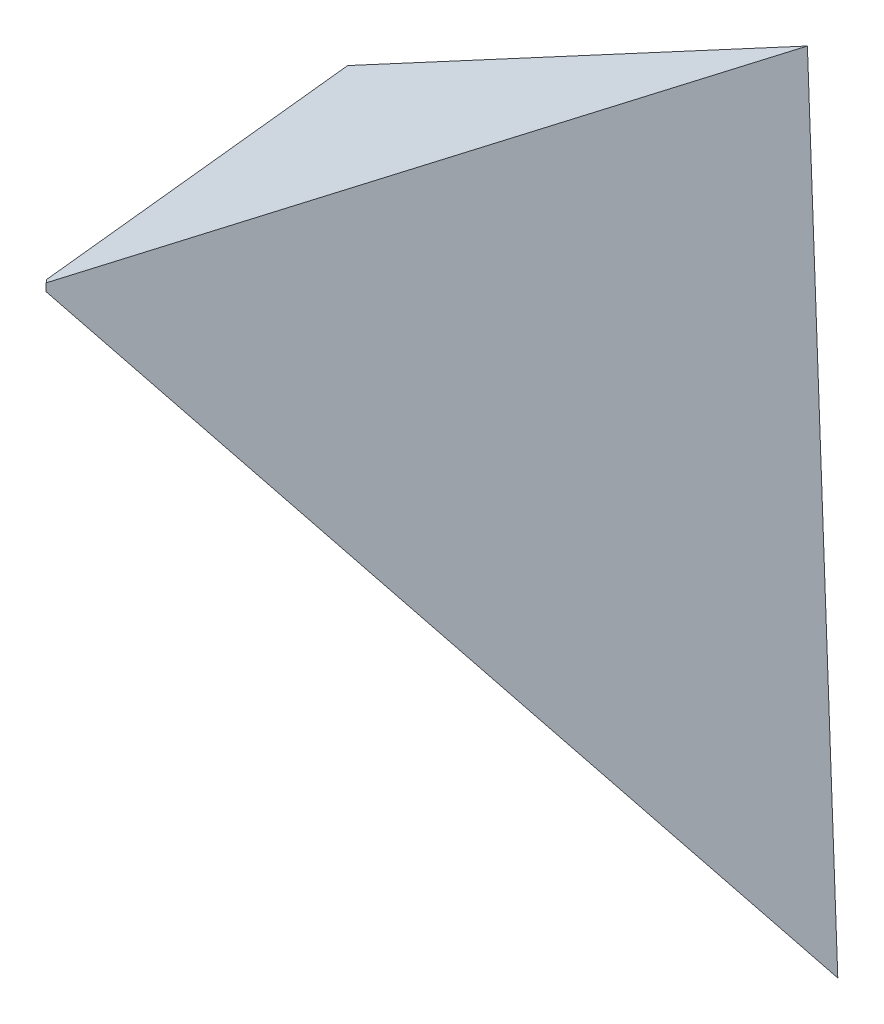
ISO-10303-21;
HEADER;
FILE_DESCRIPTION(('STEP AP214'),'2;1');
FILE_NAME('part.step','',(''),(''),'','','');
FILE_SCHEMA(('AUTOMOTIVE_DESIGN { 1 0 10303 214 1 1 1 1 }'));
ENDSEC;
DATA;
#1=APPLICATION_CONTEXT('core data for automotive mechanical design processes');
#2=APPLICATION_PROTOCOL_DEFINITION('international standard','automotive_design',2000,#1);
#3=PRODUCT_CONTEXT('',#1,'mechanical');
#4=PRODUCT('Part','Part','',(#3));
#5=PRODUCT_RELATED_PRODUCT_CATEGORY('part','',(#4));
#6=PRODUCT_DEFINITION_FORMATION('','',#4);
#7=PRODUCT_DEFINITION_CONTEXT('part definition',#1,'design');
#8=PRODUCT_DEFINITION('design','',#6,#7);
#9=PRODUCT_DEFINITION_SHAPE('','',#8);
#10=(LENGTH_UNIT() NAMED_UNIT(*) SI_UNIT(.MILLI.,.METRE.));
#11=(NAMED_UNIT(*) PLANE_ANGLE_UNIT() SI_UNIT($,.RADIAN.));
#12=(NAMED_UNIT(*) SI_UNIT($,.STERADIAN.) SOLID_ANGLE_UNIT());
#13=UNCERTAINTY_MEASURE_WITH_UNIT(LENGTH_MEASURE(1.E-05),#10,'distance_accuracy_value','');
#14=(GEOMETRIC_REPRESENTATION_CONTEXT(3) GLOBAL_UNCERTAINTY_ASSIGNED_CONTEXT((#13)) GLOBAL_UNIT_ASSIGNED_CONTEXT((#10,
#11,#12)) REPRESENTATION_CONTEXT('',''));
#15=CARTESIAN_POINT('',(0.,0.,0.));
#16=DIRECTION('',(0.,0.,1.));
#17=DIRECTION('',(1.,0.,0.));
#18=AXIS2_PLACEMENT_3D('',#15,#16,#17);
#19=CARTESIAN_POINT('',(209.23112050652,32.503640546976,175.80867233075));
#20=DIRECTION('',(-0.767091305793029,-0.000746724953363428,0.641537505512024));
#21=DIRECTION('',(-0.000973449436754686,0.999999526197985,0.));
#22=AXIS2_PLACEMENT_3D('',#19,#20,#21);
#23=PLANE('',#22);
#24=DIRECTION('',(-0.641470473020888,-0.0136095682998176,-0.767026995543866));
#25=VECTOR('',#24,1.);
#26=CARTESIAN_POINT('',(210.43033605346,35.965847138926,177.2466134144));
#27=LINE('',#26,#25);
#28=CARTESIAN_POINT('',(210.43033605346,35.965847138926,177.2466134144));
#29=VERTEX_POINT('',#28);
#30=CARTESIAN_POINT('',(207.96796166974,35.913604902121,174.30227270835));
#31=VERTEX_POINT('',#30);
#32=EDGE_CURVE('E43',#29,#31,#27,.T.);
#33=ORIENTED_EDGE('',*,*,#32,.T.);
#34=DIRECTION('',(0.00930380667661084,-0.99990710671209,0.0099607794865899));
#35=VECTOR('',#34,1.);
#36=CARTESIAN_POINT('',(207.96796166974,35.913604902121,174.30227270835));
#37=LINE('',#36,#35);
#38=CARTESIAN_POINT('',(208.03190495958,29.041433955026,174.37073124709));
#39=VERTEX_POINT('',#38);
#40=EDGE_CURVE('E106',#31,#39,#37,.T.);
#41=ORIENTED_EDGE('',*,*,#40,.T.);
#42=DIRECTION('',(0.641470473020888,0.0136095682998176,0.767026995543866));
#43=VECTOR('',#42,1.);
#44=CARTESIAN_POINT('',(208.03190495958,29.041433955026,174.37073124709));
#45=LINE('',#44,#43);
#46=CARTESIAN_POINT('',(210.4942793433,29.093676191831,177.31507195314));
#47=VERTEX_POINT('',#46);
#48=EDGE_CURVE('E100',#39,#47,#45,.T.);
#49=ORIENTED_EDGE('',*,*,#48,.T.);
#50=DIRECTION('',(-0.00930380667661584,0.99990710671209,-0.0099607794865899));
#51=VECTOR('',#50,1.);
#52=CARTESIAN_POINT('',(210.4942793433,29.093676191831,177.31507195314));
#53=LINE('',#52,#51);
#54=EDGE_CURVE('E10',#47,#29,#53,.T.);
#55=ORIENTED_EDGE('',*,*,#54,.T.);
#56=EDGE_LOOP('',(#33,#41,#49,#55));
#57=FACE_BOUND('',#56,.T.);
#58=ADVANCED_FACE('F15',(#57),#23,.T.);
#59=CARTESIAN_POINT('',(685.45305583866,35.328601961052,14.578539610758));
#60=DIRECTION('',(0.323963347202056,0.0124380243055622,0.945987867375165));
#61=DIRECTION('',(0.0383650416777523,-0.999263790786529,0.));
#62=AXIS2_PLACEMENT_3D('',#59,#60,#61);
#63=PLANE('',#62);
#64=ORIENTED_EDGE('',*,*,#54,.F.);
#65=DIRECTION('',(0.801242651909787,-0.535285983641858,-0.267355808758929));
#66=VECTOR('',#65,1.);
#67=CARTESIAN_POINT('',(210.4942793433,29.093676191831,177.31507195314));
#68=LINE('',#67,#66);
#69=CARTESIAN_POINT('',(741.89249034377,-325.9173974235,0.));
#70=VERTEX_POINT('',#69);
#71=EDGE_CURVE('E19',#47,#70,#68,.T.);
#72=ORIENTED_EDGE('',*,*,#71,.T.);
#73=DIRECTION('',(-0.0383650416777519,0.999263790786529,0.));
#74=VECTOR('',#73,1.);
#75=CARTESIAN_POINT('',(751.43129927942,-574.367182952,0.));
#76=LINE('',#75,#74);
#77=CARTESIAN_POINT('',(714.67125545038,383.09250273302,0.));
#78=VERTEX_POINT('',#77);
#79=EDGE_CURVE('E78',#70,#78,#76,.T.);
#80=ORIENTED_EDGE('',*,*,#79,.T.);
#81=DIRECTION('',(-0.791194023562528,-0.544669273675364,0.278114004309186));
#82=VECTOR('',#81,1.);
#83=CARTESIAN_POINT('',(910.249755232,517.73153721776,-68.74814282113));
#84=LINE('',#83,#82);
#85=EDGE_CURVE('E25',#78,#29,#84,.T.);
#86=ORIENTED_EDGE('',*,*,#85,.T.);
#87=EDGE_LOOP('',(#64,#72,#80,#86));
#88=FACE_BOUND('',#87,.T.);
#89=ADVANCED_FACE('F79',(#88),#63,.T.);
#90=CARTESIAN_POINT('',(534.59281678404,330.22125626934,-101.5762576263));
#91=DIRECTION('',(-0.442152801707964,0.823626691240933,0.355161897473971));
#92=DIRECTION('',(0.62624167613197,0.,0.779628990658647));
#93=AXIS2_PLACEMENT_3D('',#90,#91,#92);
#94=PLANE('',#93);
#95=ORIENTED_EDGE('',*,*,#32,.F.);
#96=ORIENTED_EDGE('',*,*,#85,.F.);
#97=DIRECTION('',(-0.881068096098351,-0.472989439668189,0.));
#98=VECTOR('',#97,1.);
#99=CARTESIAN_POINT('',(-333.2445936708,-179.4668868193,0.));
#100=LINE('',#99,#98);
#101=CARTESIAN_POINT('',(303.07806888487,162.13429127704,0.));
#102=VERTEX_POINT('',#101);
#103=EDGE_CURVE('E72',#78,#102,#100,.T.);
#104=ORIENTED_EDGE('',*,*,#103,.T.);
#105=DIRECTION('',(0.404234184859981,0.536459454869976,-0.740814401230966));
#106=VECTOR('',#105,1.);
#107=CARTESIAN_POINT('',(207.96796166974,35.913604902121,174.30227270835));
#108=LINE('',#107,#106);
#109=EDGE_CURVE('E103',#31,#102,#108,.T.);
#110=ORIENTED_EDGE('',*,*,#109,.F.);
#111=EDGE_LOOP('',(#95,#96,#104,#110));
#112=FACE_BOUND('',#111,.T.);
#113=ADVANCED_FACE('F70',(#112),#94,.T.);
#114=CARTESIAN_POINT('',(452.14653410095,30.378723241934,-264.393615672));
#115=DIRECTION('',(-0.873765212166275,-0.0129732288748441,-0.486174916404153));
#116=DIRECTION('',(-0.486215834323044,0.,0.873838750830807));
#117=AXIS2_PLACEMENT_3D('',#114,#115,#116);
#118=PLANE('',#117);
#119=ORIENTED_EDGE('',*,*,#40,.F.);
#120=ORIENTED_EDGE('',*,*,#109,.T.);
#121=DIRECTION('',(0.0148458635887471,-0.999889794094481,0.));
#122=VECTOR('',#121,1.);
#123=CARTESIAN_POINT('',(314.4208433459,-601.8175228094,0.));
#124=LINE('',#123,#122);
#125=CARTESIAN_POINT('',(306.98154270693,-100.7701610546,0.));
#126=VERTEX_POINT('',#125);
#127=EDGE_CURVE('E88',#102,#126,#124,.T.);
#128=ORIENTED_EDGE('',*,*,#127,.T.);
#129=DIRECTION('',(0.414282813217033,-0.543495802442044,-0.730056205645058));
#130=VECTOR('',#129,1.);
#131=CARTESIAN_POINT('',(208.03190495958,29.041433955026,174.37073124709));
#132=LINE('',#131,#130);
#133=EDGE_CURVE('E97',#39,#126,#132,.T.);
#134=ORIENTED_EDGE('',*,*,#133,.F.);
#135=EDGE_LOOP('',(#119,#120,#128,#134));
#136=FACE_BOUND('',#135,.T.);
#137=ADVANCED_FACE('F119',(#136),#118,.T.);
#138=CARTESIAN_POINT('',(540.12720158164,-264.5751411625,-95.65107146069));
#139=DIRECTION('',(-0.426817780110877,-0.824472590514762,0.371579776186892));
#140=DIRECTION('',(-0.888056524179931,0.459734281799236,0.));
#141=AXIS2_PLACEMENT_3D('',#138,#139,#140);
#142=PLANE('',#141);
#143=ORIENTED_EDGE('',*,*,#48,.F.);
#144=ORIENTED_EDGE('',*,*,#133,.T.);
#145=DIRECTION('',(0.888056524180042,-0.459734281799022,0.));
#146=VECTOR('',#145,1.);
#147=CARTESIAN_POINT('',(191.01282075086,-40.73479658397,0.));
#148=LINE('',#147,#146);
#149=EDGE_CURVE('E85',#126,#70,#148,.T.);
#150=ORIENTED_EDGE('',*,*,#149,.T.);
#151=ORIENTED_EDGE('',*,*,#71,.F.);
#152=EDGE_LOOP('',(#143,#144,#150,#151));
#153=FACE_BOUND('',#152,.T.);
#154=ADVANCED_FACE('F115',(#153),#142,.T.);
#155=CARTESIAN_POINT('',(-900.,-1250.,0.));
#156=DIRECTION('',(0.,0.,1.));
#157=DIRECTION('',(1.,0.,0.));
#158=AXIS2_PLACEMENT_3D('',#155,#156,#157);
#159=PLANE('',#158);
#160=ORIENTED_EDGE('',*,*,#127,.F.);
#161=ORIENTED_EDGE('',*,*,#103,.F.);
#162=ORIENTED_EDGE('',*,*,#79,.F.);
#163=ORIENTED_EDGE('',*,*,#149,.F.);
#164=EDGE_LOOP('',(#160,#161,#162,#163));
#165=FACE_BOUND('',#164,.T.);
#166=ADVANCED_FACE('F17',(#165),#159,.F.);
#167=CLOSED_SHELL('',(#58,#89,#113,#137,#154,#166));
#168=MANIFOLD_SOLID_BREP('B1',#167);
#169=ADVANCED_BREP_SHAPE_REPRESENTATION('',(#18,#168),#14);
#170=SHAPE_DEFINITION_REPRESENTATION(#9,#169);
ENDSEC;
END-ISO-10303-21;
